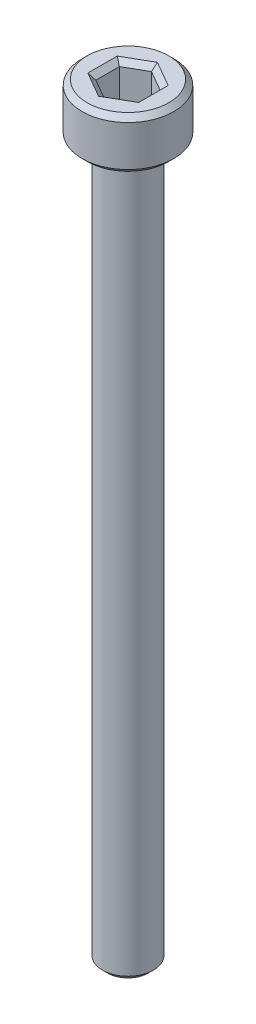
ISO-10303-21;
HEADER;
FILE_DESCRIPTION(('STEP AP214'),'2;1');
FILE_NAME('part.step','',(''),(''),'','','');
FILE_SCHEMA(('AUTOMOTIVE_DESIGN { 1 0 10303 214 1 1 1 1 }'));
ENDSEC;
DATA;
#1=APPLICATION_CONTEXT('core data for automotive mechanical design processes');
#2=APPLICATION_PROTOCOL_DEFINITION('international standard','automotive_design',2000,#1);
#3=PRODUCT_CONTEXT('',#1,'mechanical');
#4=PRODUCT('Part','Part','',(#3));
#5=PRODUCT_RELATED_PRODUCT_CATEGORY('part','',(#4));
#6=PRODUCT_DEFINITION_FORMATION('','',#4);
#7=PRODUCT_DEFINITION_CONTEXT('part definition',#1,'design');
#8=PRODUCT_DEFINITION('design','',#6,#7);
#9=PRODUCT_DEFINITION_SHAPE('','',#8);
#10=(LENGTH_UNIT() NAMED_UNIT(*) SI_UNIT(.MILLI.,.METRE.));
#11=(NAMED_UNIT(*) PLANE_ANGLE_UNIT() SI_UNIT($,.RADIAN.));
#12=(NAMED_UNIT(*) SI_UNIT($,.STERADIAN.) SOLID_ANGLE_UNIT());
#13=UNCERTAINTY_MEASURE_WITH_UNIT(LENGTH_MEASURE(1.E-05),#10,'distance_accuracy_value','');
#14=(GEOMETRIC_REPRESENTATION_CONTEXT(3) GLOBAL_UNCERTAINTY_ASSIGNED_CONTEXT((#13)) GLOBAL_UNIT_ASSIGNED_CONTEXT((#10,
#11,#12)) REPRESENTATION_CONTEXT('',''));
#15=CARTESIAN_POINT('',(0.,0.,0.));
#16=DIRECTION('',(0.,0.,1.));
#17=DIRECTION('',(1.,0.,0.));
#18=AXIS2_PLACEMENT_3D('',#15,#16,#17);
#19=CARTESIAN_POINT('',(0.,2.5,0.));
#20=DIRECTION('',(0.,-1.,0.));
#21=DIRECTION('',(0.,0.,-1.));
#22=AXIS2_PLACEMENT_3D('',#19,#20,#21);
#23=CYLINDRICAL_SURFACE('',#22,2.25);
#24=CARTESIAN_POINT('',(0.,0.249999999999998,0.));
#25=DIRECTION('',(0.,1.,0.));
#26=DIRECTION('',(0.,0.,1.));
#27=AXIS2_PLACEMENT_3D('',#24,#25,#26);
#28=CIRCLE('',#27,2.25);
#29=CARTESIAN_POINT('',(0.,0.249999999999998,2.25));
#30=VERTEX_POINT('',#29);
#31=EDGE_CURVE('E47',#30,#30,#28,.T.);
#32=ORIENTED_EDGE('',*,*,#31,.T.);
#33=EDGE_LOOP('',(#32));
#34=FACE_BOUND('',#33,.T.);
#35=CARTESIAN_POINT('',(0.,2.25000000000001,0.));
#36=DIRECTION('',(0.,1.,0.));
#37=DIRECTION('',(0.,0.,1.));
#38=AXIS2_PLACEMENT_3D('',#35,#36,#37);
#39=CIRCLE('',#38,2.25);
#40=CARTESIAN_POINT('',(0.,2.25000000000001,2.25));
#41=VERTEX_POINT('',#40);
#42=EDGE_CURVE('E192',#41,#41,#39,.F.);
#43=ORIENTED_EDGE('',*,*,#42,.T.);
#44=EDGE_LOOP('',(#43));
#45=FACE_BOUND('',#44,.T.);
#46=ADVANCED_FACE('F38',(#34,#45),#23,.T.);
#47=CARTESIAN_POINT('',(0.,2.5,0.));
#48=DIRECTION('',(0.,1.,0.));
#49=DIRECTION('',(0.,0.,1.));
#50=AXIS2_PLACEMENT_3D('',#47,#48,#49);
#51=PLANE('',#50);
#52=DIRECTION('',(0.,0.,-1.));
#53=VECTOR('',#52,1.);
#54=CARTESIAN_POINT('',(-1.25000000000001,2.5,-0.577350269189626));
#55=LINE('',#54,#53);
#56=CARTESIAN_POINT('',(-1.25000000000001,2.5,0.721687836487036));
#57=VERTEX_POINT('',#56);
#58=CARTESIAN_POINT('',(-1.25000000000001,2.5,-0.721687836487036));
#59=VERTEX_POINT('',#58);
#60=EDGE_CURVE('E180',#57,#59,#55,.T.);
#61=ORIENTED_EDGE('',*,*,#60,.T.);
#62=DIRECTION('',(0.866025403784439,0.,-0.5));
#63=VECTOR('',#62,1.);
#64=CARTESIAN_POINT('',(-0.125000000000003,2.5,-1.37120688932537));
#65=LINE('',#64,#63);
#66=CARTESIAN_POINT('',(0.,2.5,-1.44337567297407));
#67=VERTEX_POINT('',#66);
#68=EDGE_CURVE('E182',#59,#67,#65,.T.);
#69=ORIENTED_EDGE('',*,*,#68,.T.);
#70=DIRECTION('',(0.866025403784439,0.,0.5));
#71=VECTOR('',#70,1.);
#72=CARTESIAN_POINT('',(1.125,2.5,-0.793856620135741));
#73=LINE('',#72,#71);
#74=CARTESIAN_POINT('',(1.25000000000001,2.5,-0.721687836487036));
#75=VERTEX_POINT('',#74);
#76=EDGE_CURVE('E172',#67,#75,#73,.T.);
#77=ORIENTED_EDGE('',*,*,#76,.T.);
#78=DIRECTION('',(0.,0.,1.));
#79=VECTOR('',#78,1.);
#80=CARTESIAN_POINT('',(1.25000000000001,2.5,0.577350269189626));
#81=LINE('',#80,#79);
#82=CARTESIAN_POINT('',(1.25000000000001,2.5,0.721687836487035));
#83=VERTEX_POINT('',#82);
#84=EDGE_CURVE('E174',#75,#83,#81,.T.);
#85=ORIENTED_EDGE('',*,*,#84,.T.);
#86=DIRECTION('',(-0.866025403784439,0.,0.5));
#87=VECTOR('',#86,1.);
#88=CARTESIAN_POINT('',(0.125000000000003,2.5,1.37120688932537));
#89=LINE('',#88,#87);
#90=CARTESIAN_POINT('',(0.,2.5,1.44337567297407));
#91=VERTEX_POINT('',#90);
#92=EDGE_CURVE('E176',#83,#91,#89,.T.);
#93=ORIENTED_EDGE('',*,*,#92,.T.);
#94=DIRECTION('',(-0.866025403784439,0.,-0.5));
#95=VECTOR('',#94,1.);
#96=CARTESIAN_POINT('',(-1.125,2.5,0.793856620135741));
#97=LINE('',#96,#95);
#98=EDGE_CURVE('E178',#91,#57,#97,.T.);
#99=ORIENTED_EDGE('',*,*,#98,.T.);
#100=EDGE_LOOP('',(#61,#69,#77,#85,#93,#99));
#101=FACE_BOUND('',#100,.T.);
#102=CARTESIAN_POINT('',(0.,2.5,0.));
#103=DIRECTION('',(0.,1.,0.));
#104=DIRECTION('',(0.,0.,1.));
#105=AXIS2_PLACEMENT_3D('',#102,#103,#104);
#106=CIRCLE('',#105,2.00000000000001);
#107=CARTESIAN_POINT('',(0.,2.5,2.00000000000001));
#108=VERTEX_POINT('',#107);
#109=EDGE_CURVE('E169',#108,#108,#106,.T.);
#110=ORIENTED_EDGE('',*,*,#109,.T.);
#111=EDGE_LOOP('',(#110));
#112=FACE_BOUND('',#111,.T.);
#113=ADVANCED_FACE('F249',(#101,#112),#51,.T.);
#114=CARTESIAN_POINT('',(0.,0.,0.));
#115=DIRECTION('',(0.,1.,0.));
#116=DIRECTION('',(0.,0.,1.));
#117=AXIS2_PLACEMENT_3D('',#114,#115,#116);
#118=PLANE('',#117);
#119=CARTESIAN_POINT('',(0.,0.,0.));
#120=DIRECTION('',(0.,1.,0.));
#121=DIRECTION('',(0.,0.,1.));
#122=AXIS2_PLACEMENT_3D('',#119,#120,#121);
#123=CIRCLE('',#122,2.);
#124=CARTESIAN_POINT('',(0.,0.,2.));
#125=VERTEX_POINT('',#124);
#126=EDGE_CURVE('E11',#125,#125,#123,.F.);
#127=ORIENTED_EDGE('',*,*,#126,.T.);
#128=EDGE_LOOP('',(#127));
#129=FACE_BOUND('',#128,.T.);
#130=CARTESIAN_POINT('',(0.,0.,0.));
#131=DIRECTION('',(0.,-1.,0.));
#132=DIRECTION('',(0.,0.,-1.));
#133=AXIS2_PLACEMENT_3D('',#130,#131,#132);
#134=CIRCLE('',#133,1.25);
#135=CARTESIAN_POINT('',(0.,0.,-1.25));
#136=VERTEX_POINT('',#135);
#137=EDGE_CURVE('E142',#136,#136,#134,.T.);
#138=ORIENTED_EDGE('',*,*,#137,.F.);
#139=EDGE_LOOP('',(#138));
#140=FACE_BOUND('',#139,.T.);
#141=ADVANCED_FACE('F245',(#129,#140),#118,.F.);
#142=CARTESIAN_POINT('',(0.999999999999999,0.5,-0.577350269189626));
#143=DIRECTION('',(0.5,0.,-0.866025403784439));
#144=DIRECTION('',(-0.866025403784439,0.,-0.5));
#145=AXIS2_PLACEMENT_3D('',#142,#143,#144);
#146=PLANE('',#145);
#147=DIRECTION('',(0.,1.,0.));
#148=VECTOR('',#147,1.);
#149=CARTESIAN_POINT('',(0.999999999999999,0.5,-0.577350269189626));
#150=LINE('',#149,#148);
#151=CARTESIAN_POINT('',(0.999999999999999,0.5,-0.577350269189626));
#152=VERTEX_POINT('',#151);
#153=CARTESIAN_POINT('',(0.999999999999999,2.25,-0.577350269189626));
#154=VERTEX_POINT('',#153);
#155=EDGE_CURVE('E151',#152,#154,#150,.T.);
#156=ORIENTED_EDGE('',*,*,#155,.T.);
#157=DIRECTION('',(-0.866025403784439,0.,-0.5));
#158=VECTOR('',#157,1.);
#159=CARTESIAN_POINT('',(0.,2.25,-1.15470053837925));
#160=LINE('',#159,#158);
#161=CARTESIAN_POINT('',(0.,2.25,-1.15470053837925));
#162=VERTEX_POINT('',#161);
#163=EDGE_CURVE('E119',#154,#162,#160,.T.);
#164=ORIENTED_EDGE('',*,*,#163,.T.);
#165=DIRECTION('',(0.,1.,0.));
#166=VECTOR('',#165,1.);
#167=CARTESIAN_POINT('',(0.,0.5,-1.15470053837925));
#168=LINE('',#167,#166);
#169=CARTESIAN_POINT('',(0.,0.5,-1.15470053837925));
#170=VERTEX_POINT('',#169);
#171=EDGE_CURVE('E112',#170,#162,#168,.T.);
#172=ORIENTED_EDGE('',*,*,#171,.F.);
#173=DIRECTION('',(-0.866025403784439,0.,-0.5));
#174=VECTOR('',#173,1.);
#175=CARTESIAN_POINT('',(0.999999999999999,0.5,-0.577350269189626));
#176=LINE('',#175,#174);
#177=EDGE_CURVE('E116',#152,#170,#176,.T.);
#178=ORIENTED_EDGE('',*,*,#177,.F.);
#179=EDGE_LOOP('',(#156,#164,#172,#178));
#180=FACE_BOUND('',#179,.T.);
#181=ADVANCED_FACE('F114',(#180),#146,.F.);
#182=CARTESIAN_POINT('',(1.,0.5,0.577350269189626));
#183=DIRECTION('',(1.,0.,0.));
#184=DIRECTION('',(0.,0.,-1.));
#185=AXIS2_PLACEMENT_3D('',#182,#183,#184);
#186=PLANE('',#185);
#187=DIRECTION('',(0.,1.,0.));
#188=VECTOR('',#187,1.);
#189=CARTESIAN_POINT('',(1.,0.5,0.577350269189626));
#190=LINE('',#189,#188);
#191=CARTESIAN_POINT('',(1.,0.5,0.577350269189626));
#192=VERTEX_POINT('',#191);
#193=CARTESIAN_POINT('',(1.,2.25,0.577350269189626));
#194=VERTEX_POINT('',#193);
#195=EDGE_CURVE('E153',#192,#194,#190,.T.);
#196=ORIENTED_EDGE('',*,*,#195,.T.);
#197=DIRECTION('',(0.,0.,-1.));
#198=VECTOR('',#197,1.);
#199=CARTESIAN_POINT('',(0.999999999999999,2.25,-0.577350269189626));
#200=LINE('',#199,#198);
#201=EDGE_CURVE('E55',#194,#154,#200,.T.);
#202=ORIENTED_EDGE('',*,*,#201,.T.);
#203=ORIENTED_EDGE('',*,*,#155,.F.);
#204=DIRECTION('',(0.,0.,-1.));
#205=VECTOR('',#204,1.);
#206=CARTESIAN_POINT('',(1.,0.5,0.577350269189626));
#207=LINE('',#206,#205);
#208=EDGE_CURVE('E124',#192,#152,#207,.T.);
#209=ORIENTED_EDGE('',*,*,#208,.F.);
#210=EDGE_LOOP('',(#196,#202,#203,#209));
#211=FACE_BOUND('',#210,.T.);
#212=ADVANCED_FACE('F237',(#211),#186,.F.);
#213=CARTESIAN_POINT('',(0.,0.5,1.15470053837925));
#214=DIRECTION('',(0.5,0.,0.866025403784439));
#215=DIRECTION('',(0.866025403784439,0.,-0.5));
#216=AXIS2_PLACEMENT_3D('',#213,#214,#215);
#217=PLANE('',#216);
#218=DIRECTION('',(0.,1.,0.));
#219=VECTOR('',#218,1.);
#220=CARTESIAN_POINT('',(0.,0.5,1.15470053837925));
#221=LINE('',#220,#219);
#222=CARTESIAN_POINT('',(0.,0.5,1.15470053837925));
#223=VERTEX_POINT('',#222);
#224=CARTESIAN_POINT('',(0.,2.25,1.15470053837925));
#225=VERTEX_POINT('',#224);
#226=EDGE_CURVE('E155',#223,#225,#221,.T.);
#227=ORIENTED_EDGE('',*,*,#226,.T.);
#228=DIRECTION('',(0.866025403784439,0.,-0.5));
#229=VECTOR('',#228,1.);
#230=CARTESIAN_POINT('',(1.,2.25,0.577350269189626));
#231=LINE('',#230,#229);
#232=EDGE_CURVE('E63',#225,#194,#231,.T.);
#233=ORIENTED_EDGE('',*,*,#232,.T.);
#234=ORIENTED_EDGE('',*,*,#195,.F.);
#235=DIRECTION('',(0.866025403784439,0.,-0.5));
#236=VECTOR('',#235,1.);
#237=CARTESIAN_POINT('',(0.,0.5,1.15470053837925));
#238=LINE('',#237,#236);
#239=EDGE_CURVE('E148',#223,#192,#238,.T.);
#240=ORIENTED_EDGE('',*,*,#239,.F.);
#241=EDGE_LOOP('',(#227,#233,#234,#240));
#242=FACE_BOUND('',#241,.T.);
#243=ADVANCED_FACE('F236',(#242),#217,.F.);
#244=CARTESIAN_POINT('',(-1.,0.5,0.577350269189626));
#245=DIRECTION('',(-0.5,0.,0.866025403784439));
#246=DIRECTION('',(0.866025403784439,0.,0.5));
#247=AXIS2_PLACEMENT_3D('',#244,#245,#246);
#248=PLANE('',#247);
#249=DIRECTION('',(0.,1.,0.));
#250=VECTOR('',#249,1.);
#251=CARTESIAN_POINT('',(-1.,0.5,0.577350269189626));
#252=LINE('',#251,#250);
#253=CARTESIAN_POINT('',(-1.,0.5,0.577350269189626));
#254=VERTEX_POINT('',#253);
#255=CARTESIAN_POINT('',(-1.,2.25,0.577350269189626));
#256=VERTEX_POINT('',#255);
#257=EDGE_CURVE('E157',#254,#256,#252,.T.);
#258=ORIENTED_EDGE('',*,*,#257,.T.);
#259=DIRECTION('',(0.866025403784439,0.,0.5));
#260=VECTOR('',#259,1.);
#261=CARTESIAN_POINT('',(0.,2.25,1.15470053837925));
#262=LINE('',#261,#260);
#263=EDGE_CURVE('E187',#256,#225,#262,.T.);
#264=ORIENTED_EDGE('',*,*,#263,.T.);
#265=ORIENTED_EDGE('',*,*,#226,.F.);
#266=DIRECTION('',(0.866025403784439,0.,0.5));
#267=VECTOR('',#266,1.);
#268=CARTESIAN_POINT('',(-1.,0.5,0.577350269189626));
#269=LINE('',#268,#267);
#270=EDGE_CURVE('E145',#254,#223,#269,.T.);
#271=ORIENTED_EDGE('',*,*,#270,.F.);
#272=EDGE_LOOP('',(#258,#264,#265,#271));
#273=FACE_BOUND('',#272,.T.);
#274=ADVANCED_FACE('F235',(#273),#248,.F.);
#275=CARTESIAN_POINT('',(-1.,0.5,-0.577350269189626));
#276=DIRECTION('',(-1.,0.,0.));
#277=DIRECTION('',(0.,0.,1.));
#278=AXIS2_PLACEMENT_3D('',#275,#276,#277);
#279=PLANE('',#278);
#280=DIRECTION('',(0.,1.,0.));
#281=VECTOR('',#280,1.);
#282=CARTESIAN_POINT('',(-1.,0.5,-0.577350269189626));
#283=LINE('',#282,#281);
#284=CARTESIAN_POINT('',(-1.,0.5,-0.577350269189626));
#285=VERTEX_POINT('',#284);
#286=CARTESIAN_POINT('',(-1.,2.25,-0.577350269189626));
#287=VERTEX_POINT('',#286);
#288=EDGE_CURVE('E123',#285,#287,#283,.T.);
#289=ORIENTED_EDGE('',*,*,#288,.T.);
#290=DIRECTION('',(0.,0.,1.));
#291=VECTOR('',#290,1.);
#292=CARTESIAN_POINT('',(-1.,2.25,0.577350269189626));
#293=LINE('',#292,#291);
#294=EDGE_CURVE('E185',#287,#256,#293,.T.);
#295=ORIENTED_EDGE('',*,*,#294,.T.);
#296=ORIENTED_EDGE('',*,*,#257,.F.);
#297=DIRECTION('',(0.,0.,1.));
#298=VECTOR('',#297,1.);
#299=CARTESIAN_POINT('',(-1.,0.5,-0.577350269189626));
#300=LINE('',#299,#298);
#301=EDGE_CURVE('E133',#285,#254,#300,.T.);
#302=ORIENTED_EDGE('',*,*,#301,.F.);
#303=EDGE_LOOP('',(#289,#295,#296,#302));
#304=FACE_BOUND('',#303,.T.);
#305=ADVANCED_FACE('F231',(#304),#279,.F.);
#306=CARTESIAN_POINT('',(0.,0.5,-1.15470053837925));
#307=DIRECTION('',(-0.5,0.,-0.866025403784439));
#308=DIRECTION('',(-0.866025403784439,0.,0.5));
#309=AXIS2_PLACEMENT_3D('',#306,#307,#308);
#310=PLANE('',#309);
#311=ORIENTED_EDGE('',*,*,#171,.T.);
#312=DIRECTION('',(-0.866025403784439,0.,0.5));
#313=VECTOR('',#312,1.);
#314=CARTESIAN_POINT('',(-1.,2.25,-0.577350269189626));
#315=LINE('',#314,#313);
#316=EDGE_CURVE('E167',#162,#287,#315,.T.);
#317=ORIENTED_EDGE('',*,*,#316,.T.);
#318=ORIENTED_EDGE('',*,*,#288,.F.);
#319=DIRECTION('',(-0.866025403784439,0.,0.5));
#320=VECTOR('',#319,1.);
#321=CARTESIAN_POINT('',(0.,0.5,-1.15470053837925));
#322=LINE('',#321,#320);
#323=EDGE_CURVE('E127',#170,#285,#322,.T.);
#324=ORIENTED_EDGE('',*,*,#323,.F.);
#325=EDGE_LOOP('',(#311,#317,#318,#324));
#326=FACE_BOUND('',#325,.T.);
#327=ADVANCED_FACE('F128',(#326),#310,.F.);
#328=CARTESIAN_POINT('',(0.,0.5,0.));
#329=DIRECTION('',(0.,1.,0.));
#330=DIRECTION('',(0.,0.,1.));
#331=AXIS2_PLACEMENT_3D('',#328,#329,#330);
#332=PLANE('',#331);
#333=ORIENTED_EDGE('',*,*,#177,.T.);
#334=ORIENTED_EDGE('',*,*,#323,.T.);
#335=ORIENTED_EDGE('',*,*,#301,.T.);
#336=ORIENTED_EDGE('',*,*,#270,.T.);
#337=ORIENTED_EDGE('',*,*,#239,.T.);
#338=ORIENTED_EDGE('',*,*,#208,.T.);
#339=EDGE_LOOP('',(#333,#334,#335,#336,#337,#338));
#340=FACE_BOUND('',#339,.T.);
#341=ADVANCED_FACE('F135',(#340),#332,.T.);
#342=CARTESIAN_POINT('',(0.,-35.,0.));
#343=DIRECTION('',(0.,1.,0.));
#344=DIRECTION('',(0.,0.,1.));
#345=AXIS2_PLACEMENT_3D('',#342,#343,#344);
#346=CYLINDRICAL_SURFACE('',#345,1.25);
#347=CARTESIAN_POINT('',(0.,-34.75,0.));
#348=DIRECTION('',(0.,-1.,0.));
#349=DIRECTION('',(0.,0.,-1.));
#350=AXIS2_PLACEMENT_3D('',#347,#348,#349);
#351=CIRCLE('',#350,1.25);
#352=CARTESIAN_POINT('',(0.,-34.75,-1.25));
#353=VERTEX_POINT('',#352);
#354=EDGE_CURVE('E164',#353,#353,#351,.F.);
#355=ORIENTED_EDGE('',*,*,#354,.T.);
#356=EDGE_LOOP('',(#355));
#357=FACE_BOUND('',#356,.T.);
#358=ORIENTED_EDGE('',*,*,#137,.T.);
#359=EDGE_LOOP('',(#358));
#360=FACE_BOUND('',#359,.T.);
#361=ADVANCED_FACE('F294',(#357,#360),#346,.T.);
#362=CARTESIAN_POINT('',(0.,-35.,0.));
#363=DIRECTION('',(0.,-1.,0.));
#364=DIRECTION('',(0.,0.,-1.));
#365=AXIS2_PLACEMENT_3D('',#362,#363,#364);
#366=PLANE('',#365);
#367=CARTESIAN_POINT('',(0.,-35.,0.));
#368=DIRECTION('',(0.,-1.,0.));
#369=DIRECTION('',(0.,0.,-1.));
#370=AXIS2_PLACEMENT_3D('',#367,#368,#369);
#371=CIRCLE('',#370,1.);
#372=CARTESIAN_POINT('',(0.,-35.,-1.));
#373=VERTEX_POINT('',#372);
#374=EDGE_CURVE('E161',#373,#373,#371,.T.);
#375=ORIENTED_EDGE('',*,*,#374,.T.);
#376=EDGE_LOOP('',(#375));
#377=FACE_BOUND('',#376,.T.);
#378=ADVANCED_FACE('F263',(#377),#366,.T.);
#379=CARTESIAN_POINT('',(0.,-35.,0.));
#380=DIRECTION('',(0.,1.,0.));
#381=DIRECTION('',(0.,0.,1.));
#382=AXIS2_PLACEMENT_3D('',#379,#380,#381);
#383=CONICAL_SURFACE('',#382,1.,0.785398163397446);
#384=ORIENTED_EDGE('',*,*,#354,.F.);
#385=EDGE_LOOP('',(#384));
#386=FACE_BOUND('',#385,.T.);
#387=ORIENTED_EDGE('',*,*,#374,.F.);
#388=EDGE_LOOP('',(#387));
#389=FACE_BOUND('',#388,.T.);
#390=ADVANCED_FACE('F260',(#386,#389),#383,.T.);
#391=CARTESIAN_POINT('',(0.,2.25,1.15470053837925));
#392=DIRECTION('',(-0.353553390593272,0.70710678118655,-0.612372435695792));
#393=DIRECTION('',(-0.866025403784439,0.,0.5));
#394=AXIS2_PLACEMENT_3D('',#391,#392,#393);
#395=PLANE('',#394);
#396=DIRECTION('',(0.,0.654653670707974,0.755928946018457));
#397=VECTOR('',#396,1.);
#398=CARTESIAN_POINT('',(0.,1.96428571428571,0.824786098842321));
#399=LINE('',#398,#397);
#400=EDGE_CURVE('E140',#91,#225,#399,.F.);
#401=ORIENTED_EDGE('',*,*,#400,.F.);
#402=ORIENTED_EDGE('',*,*,#92,.F.);
#403=DIRECTION('',(0.654653670707979,0.654653670707974,0.377964473009228));
#404=VECTOR('',#403,1.);
#405=CARTESIAN_POINT('',(0.714285714285712,1.96428571428571,0.41239304942116));
#406=LINE('',#405,#404);
#407=EDGE_CURVE('E42',#194,#83,#406,.T.);
#408=ORIENTED_EDGE('',*,*,#407,.F.);
#409=ORIENTED_EDGE('',*,*,#232,.F.);
#410=EDGE_LOOP('',(#401,#402,#408,#409));
#411=FACE_BOUND('',#410,.T.);
#412=ADVANCED_FACE('F215',(#411),#395,.T.);
#413=CARTESIAN_POINT('',(1.,2.25,0.577350269189626));
#414=DIRECTION('',(-0.707106781186545,0.70710678118655,0.));
#415=DIRECTION('',(0.,0.,1.));
#416=AXIS2_PLACEMENT_3D('',#413,#414,#415);
#417=PLANE('',#416);
#418=ORIENTED_EDGE('',*,*,#407,.T.);
#419=ORIENTED_EDGE('',*,*,#84,.F.);
#420=DIRECTION('',(0.654653670707979,0.654653670707974,-0.377964473009228));
#421=VECTOR('',#420,1.);
#422=CARTESIAN_POINT('',(0.714285714285712,1.96428571428571,-0.412393049421161));
#423=LINE('',#422,#421);
#424=EDGE_CURVE('E204',#154,#75,#423,.T.);
#425=ORIENTED_EDGE('',*,*,#424,.F.);
#426=ORIENTED_EDGE('',*,*,#201,.F.);
#427=EDGE_LOOP('',(#418,#419,#425,#426));
#428=FACE_BOUND('',#427,.T.);
#429=ADVANCED_FACE('F220',(#428),#417,.T.);
#430=CARTESIAN_POINT('',(-1.,2.25,0.577350269189626));
#431=DIRECTION('',(0.353553390593272,0.707106781186551,-0.612372435695792));
#432=DIRECTION('',(-0.866025403784439,0.,-0.5));
#433=AXIS2_PLACEMENT_3D('',#430,#431,#432);
#434=PLANE('',#433);
#435=ORIENTED_EDGE('',*,*,#400,.T.);
#436=ORIENTED_EDGE('',*,*,#263,.F.);
#437=DIRECTION('',(-0.654653670707979,0.654653670707974,0.37796447300923));
#438=VECTOR('',#437,1.);
#439=CARTESIAN_POINT('',(-0.714285714285711,1.96428571428571,0.41239304942116));
#440=LINE('',#439,#438);
#441=EDGE_CURVE('E201',#57,#256,#440,.F.);
#442=ORIENTED_EDGE('',*,*,#441,.F.);
#443=ORIENTED_EDGE('',*,*,#98,.F.);
#444=EDGE_LOOP('',(#435,#436,#442,#443));
#445=FACE_BOUND('',#444,.T.);
#446=ADVANCED_FACE('F211',(#445),#434,.T.);
#447=CARTESIAN_POINT('',(0.999999999999999,2.25,-0.577350269189626));
#448=DIRECTION('',(-0.353553390593272,0.70710678118655,0.612372435695792));
#449=DIRECTION('',(0.866025403784439,0.,0.5));
#450=AXIS2_PLACEMENT_3D('',#447,#448,#449);
#451=PLANE('',#450);
#452=ORIENTED_EDGE('',*,*,#424,.T.);
#453=ORIENTED_EDGE('',*,*,#76,.F.);
#454=DIRECTION('',(0.,-0.654653670707974,0.755928946018457));
#455=VECTOR('',#454,1.);
#456=CARTESIAN_POINT('',(0.,2.25,-1.15470053837925));
#457=LINE('',#456,#455);
#458=EDGE_CURVE('E199',#162,#67,#457,.F.);
#459=ORIENTED_EDGE('',*,*,#458,.F.);
#460=ORIENTED_EDGE('',*,*,#163,.F.);
#461=EDGE_LOOP('',(#452,#453,#459,#460));
#462=FACE_BOUND('',#461,.T.);
#463=ADVANCED_FACE('F223',(#462),#451,.T.);
#464=CARTESIAN_POINT('',(-1.,2.25,-0.577350269189626));
#465=DIRECTION('',(0.707106781186545,0.70710678118655,0.));
#466=DIRECTION('',(0.,0.,-1.));
#467=AXIS2_PLACEMENT_3D('',#464,#465,#466);
#468=PLANE('',#467);
#469=ORIENTED_EDGE('',*,*,#441,.T.);
#470=ORIENTED_EDGE('',*,*,#294,.F.);
#471=DIRECTION('',(-0.654653670707979,0.654653670707974,-0.377964473009229));
#472=VECTOR('',#471,1.);
#473=CARTESIAN_POINT('',(-0.714285714285713,1.96428571428571,-0.41239304942116));
#474=LINE('',#473,#472);
#475=EDGE_CURVE('E197',#59,#287,#474,.F.);
#476=ORIENTED_EDGE('',*,*,#475,.F.);
#477=ORIENTED_EDGE('',*,*,#60,.F.);
#478=EDGE_LOOP('',(#469,#470,#476,#477));
#479=FACE_BOUND('',#478,.T.);
#480=ADVANCED_FACE('F268',(#479),#468,.T.);
#481=CARTESIAN_POINT('',(0.,2.25,-1.15470053837925));
#482=DIRECTION('',(0.353553390593272,0.707106781186551,0.612372435695792));
#483=DIRECTION('',(0.866025403784439,0.,-0.5));
#484=AXIS2_PLACEMENT_3D('',#481,#482,#483);
#485=PLANE('',#484);
#486=ORIENTED_EDGE('',*,*,#458,.T.);
#487=ORIENTED_EDGE('',*,*,#68,.F.);
#488=ORIENTED_EDGE('',*,*,#475,.T.);
#489=ORIENTED_EDGE('',*,*,#316,.F.);
#490=EDGE_LOOP('',(#486,#487,#488,#489));
#491=FACE_BOUND('',#490,.T.);
#492=ADVANCED_FACE('F227',(#491),#485,.T.);
#493=CARTESIAN_POINT('',(0.,0.249999999999998,0.));
#494=DIRECTION('',(0.,1.,0.));
#495=DIRECTION('',(0.,0.,1.));
#496=AXIS2_PLACEMENT_3D('',#493,#494,#495);
#497=CONICAL_SURFACE('',#496,2.25,0.78539816339745);
#498=ORIENTED_EDGE('',*,*,#126,.F.);
#499=EDGE_LOOP('',(#498));
#500=FACE_BOUND('',#499,.T.);
#501=ORIENTED_EDGE('',*,*,#31,.F.);
#502=EDGE_LOOP('',(#501));
#503=FACE_BOUND('',#502,.T.);
#504=ADVANCED_FACE('F267',(#500,#503),#497,.T.);
#505=CARTESIAN_POINT('',(0.,2.5,0.));
#506=DIRECTION('',(0.,-1.,0.));
#507=DIRECTION('',(0.,0.,-1.));
#508=AXIS2_PLACEMENT_3D('',#505,#506,#507);
#509=CONICAL_SURFACE('',#508,2.00000000000001,0.785398163397447);
#510=ORIENTED_EDGE('',*,*,#42,.F.);
#511=EDGE_LOOP('',(#510));
#512=FACE_BOUND('',#511,.T.);
#513=ORIENTED_EDGE('',*,*,#109,.F.);
#514=EDGE_LOOP('',(#513));
#515=FACE_BOUND('',#514,.T.);
#516=ADVANCED_FACE('F40',(#512,#515),#509,.T.);
#517=CLOSED_SHELL('',(#46,#113,#141,#181,#212,#243,#274,#305,#327,#341,#361,#378,#390,#412,#429,
#446,#463,#480,#492,#504,#516));
#518=MANIFOLD_SOLID_BREP('B2',#517);
#519=ADVANCED_BREP_SHAPE_REPRESENTATION('',(#18,#518),#14);
#520=SHAPE_DEFINITION_REPRESENTATION(#9,#519);
ENDSEC;
END-ISO-10303-21;
